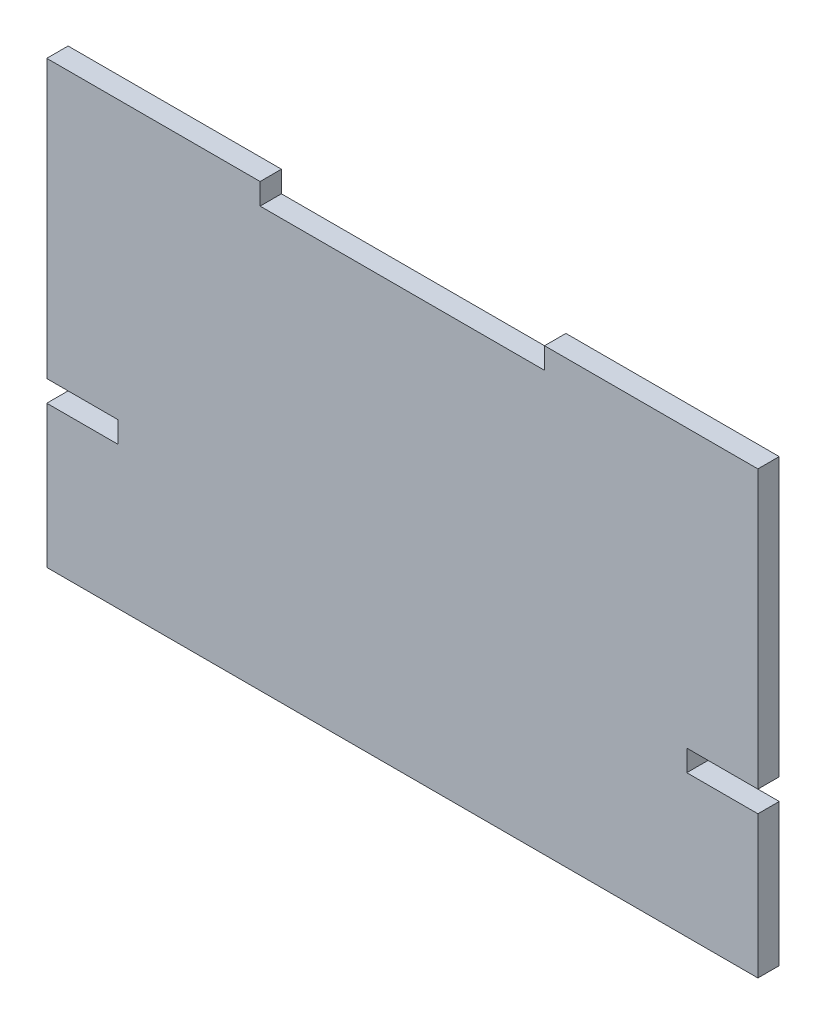
ISO-10303-21;
HEADER;
FILE_DESCRIPTION(('STEP AP214'),'2;1');
FILE_NAME('part.step','',(''),(''),'','','');
FILE_SCHEMA(('AUTOMOTIVE_DESIGN { 1 0 10303 214 1 1 1 1 }'));
ENDSEC;
DATA;
#1=APPLICATION_CONTEXT('core data for automotive mechanical design processes');
#2=APPLICATION_PROTOCOL_DEFINITION('international standard','automotive_design',2000,#1);
#3=PRODUCT_CONTEXT('',#1,'mechanical');
#4=PRODUCT('Part','Part','',(#3));
#5=PRODUCT_RELATED_PRODUCT_CATEGORY('part','',(#4));
#6=PRODUCT_DEFINITION_FORMATION('','',#4);
#7=PRODUCT_DEFINITION_CONTEXT('part definition',#1,'design');
#8=PRODUCT_DEFINITION('design','',#6,#7);
#9=PRODUCT_DEFINITION_SHAPE('','',#8);
#10=(LENGTH_UNIT() NAMED_UNIT(*) SI_UNIT(.MILLI.,.METRE.));
#11=(NAMED_UNIT(*) PLANE_ANGLE_UNIT() SI_UNIT($,.RADIAN.));
#12=(NAMED_UNIT(*) SI_UNIT($,.STERADIAN.) SOLID_ANGLE_UNIT());
#13=UNCERTAINTY_MEASURE_WITH_UNIT(LENGTH_MEASURE(1.E-05),#10,'distance_accuracy_value','');
#14=(GEOMETRIC_REPRESENTATION_CONTEXT(3) GLOBAL_UNCERTAINTY_ASSIGNED_CONTEXT((#13)) GLOBAL_UNIT_ASSIGNED_CONTEXT((#10,
#11,#12)) REPRESENTATION_CONTEXT('',''));
#15=CARTESIAN_POINT('',(0.,0.,0.));
#16=DIRECTION('',(0.,0.,1.));
#17=DIRECTION('',(1.,0.,0.));
#18=AXIS2_PLACEMENT_3D('',#15,#16,#17);
#19=CARTESIAN_POINT('',(-50.,-8.00000000000001,3.));
#20=DIRECTION('',(1.,0.,0.));
#21=DIRECTION('',(0.,0.,-1.));
#22=AXIS2_PLACEMENT_3D('',#19,#20,#21);
#23=PLANE('',#22);
#24=DIRECTION('',(0.,-1.,0.));
#25=VECTOR('',#24,1.);
#26=CARTESIAN_POINT('',(-50.,-8.00000000000001,0.));
#27=LINE('',#26,#25);
#28=CARTESIAN_POINT('',(-50.,31.,0.));
#29=VERTEX_POINT('',#28);
#30=CARTESIAN_POINT('',(-50.,-8.00000000000001,0.));
#31=VERTEX_POINT('',#30);
#32=EDGE_CURVE('E181',#29,#31,#27,.T.);
#33=ORIENTED_EDGE('',*,*,#32,.T.);
#34=DIRECTION('',(0.,0.,-1.));
#35=VECTOR('',#34,1.);
#36=CARTESIAN_POINT('',(-50.,-8.00000000000001,3.));
#37=LINE('',#36,#35);
#38=CARTESIAN_POINT('',(-50.,-8.00000000000001,3.));
#39=VERTEX_POINT('',#38);
#40=EDGE_CURVE('E11',#39,#31,#37,.T.);
#41=ORIENTED_EDGE('',*,*,#40,.F.);
#42=DIRECTION('',(0.,-1.,0.));
#43=VECTOR('',#42,1.);
#44=CARTESIAN_POINT('',(-50.,-8.00000000000001,3.));
#45=LINE('',#44,#43);
#46=CARTESIAN_POINT('',(-50.,31.,3.));
#47=VERTEX_POINT('',#46);
#48=EDGE_CURVE('E211',#47,#39,#45,.T.);
#49=ORIENTED_EDGE('',*,*,#48,.F.);
#50=DIRECTION('',(0.,0.,-1.));
#51=VECTOR('',#50,1.);
#52=CARTESIAN_POINT('',(-50.,31.,3.));
#53=LINE('',#52,#51);
#54=EDGE_CURVE('E177',#47,#29,#53,.T.);
#55=ORIENTED_EDGE('',*,*,#54,.T.);
#56=EDGE_LOOP('',(#33,#41,#49,#55));
#57=FACE_BOUND('',#56,.T.);
#58=ADVANCED_FACE('F37',(#57),#23,.F.);
#59=CARTESIAN_POINT('',(-40.,-8.00000000000001,3.));
#60=DIRECTION('',(0.,1.,0.));
#61=DIRECTION('',(0.,0.,1.));
#62=AXIS2_PLACEMENT_3D('',#59,#60,#61);
#63=PLANE('',#62);
#64=DIRECTION('',(1.,0.,0.));
#65=VECTOR('',#64,1.);
#66=CARTESIAN_POINT('',(-40.,-8.00000000000001,0.));
#67=LINE('',#66,#65);
#68=CARTESIAN_POINT('',(-40.,-8.00000000000001,0.));
#69=VERTEX_POINT('',#68);
#70=EDGE_CURVE('E184',#31,#69,#67,.T.);
#71=ORIENTED_EDGE('',*,*,#70,.T.);
#72=DIRECTION('',(0.,0.,-1.));
#73=VECTOR('',#72,1.);
#74=CARTESIAN_POINT('',(-40.,-8.00000000000001,3.));
#75=LINE('',#74,#73);
#76=CARTESIAN_POINT('',(-40.,-8.00000000000001,3.));
#77=VERTEX_POINT('',#76);
#78=EDGE_CURVE('E45',#77,#69,#75,.T.);
#79=ORIENTED_EDGE('',*,*,#78,.F.);
#80=DIRECTION('',(1.,0.,0.));
#81=VECTOR('',#80,1.);
#82=CARTESIAN_POINT('',(-40.,-8.00000000000001,3.));
#83=LINE('',#82,#81);
#84=EDGE_CURVE('E120',#39,#77,#83,.T.);
#85=ORIENTED_EDGE('',*,*,#84,.F.);
#86=ORIENTED_EDGE('',*,*,#40,.T.);
#87=EDGE_LOOP('',(#71,#79,#85,#86));
#88=FACE_BOUND('',#87,.T.);
#89=ADVANCED_FACE('F309',(#88),#63,.F.);
#90=CARTESIAN_POINT('',(-40.,-11.,3.));
#91=DIRECTION('',(1.,0.,0.));
#92=DIRECTION('',(0.,0.,-1.));
#93=AXIS2_PLACEMENT_3D('',#90,#91,#92);
#94=PLANE('',#93);
#95=DIRECTION('',(0.,-1.,0.));
#96=VECTOR('',#95,1.);
#97=CARTESIAN_POINT('',(-40.,-11.,0.));
#98=LINE('',#97,#96);
#99=CARTESIAN_POINT('',(-40.,-11.,0.));
#100=VERTEX_POINT('',#99);
#101=EDGE_CURVE('E186',#69,#100,#98,.T.);
#102=ORIENTED_EDGE('',*,*,#101,.T.);
#103=DIRECTION('',(0.,0.,-1.));
#104=VECTOR('',#103,1.);
#105=CARTESIAN_POINT('',(-40.,-11.,3.));
#106=LINE('',#105,#104);
#107=CARTESIAN_POINT('',(-40.,-11.,3.));
#108=VERTEX_POINT('',#107);
#109=EDGE_CURVE('E242',#108,#100,#106,.T.);
#110=ORIENTED_EDGE('',*,*,#109,.F.);
#111=DIRECTION('',(0.,-1.,0.));
#112=VECTOR('',#111,1.);
#113=CARTESIAN_POINT('',(-40.,-11.,3.));
#114=LINE('',#113,#112);
#115=EDGE_CURVE('E250',#77,#108,#114,.T.);
#116=ORIENTED_EDGE('',*,*,#115,.F.);
#117=ORIENTED_EDGE('',*,*,#78,.T.);
#118=EDGE_LOOP('',(#102,#110,#116,#117));
#119=FACE_BOUND('',#118,.T.);
#120=ADVANCED_FACE('F248',(#119),#94,.F.);
#121=CARTESIAN_POINT('',(-50.,-11.,3.));
#122=DIRECTION('',(0.,-1.,0.));
#123=DIRECTION('',(0.,0.,-1.));
#124=AXIS2_PLACEMENT_3D('',#121,#122,#123);
#125=PLANE('',#124);
#126=DIRECTION('',(-1.,0.,0.));
#127=VECTOR('',#126,1.);
#128=CARTESIAN_POINT('',(-50.,-11.,0.));
#129=LINE('',#128,#127);
#130=CARTESIAN_POINT('',(-50.,-11.,0.));
#131=VERTEX_POINT('',#130);
#132=EDGE_CURVE('E188',#100,#131,#129,.T.);
#133=ORIENTED_EDGE('',*,*,#132,.T.);
#134=DIRECTION('',(0.,0.,-1.));
#135=VECTOR('',#134,1.);
#136=CARTESIAN_POINT('',(-50.,-11.,3.));
#137=LINE('',#136,#135);
#138=CARTESIAN_POINT('',(-50.,-11.,3.));
#139=VERTEX_POINT('',#138);
#140=EDGE_CURVE('E239',#139,#131,#137,.T.);
#141=ORIENTED_EDGE('',*,*,#140,.F.);
#142=DIRECTION('',(-1.,0.,0.));
#143=VECTOR('',#142,1.);
#144=CARTESIAN_POINT('',(-50.,-11.,3.));
#145=LINE('',#144,#143);
#146=EDGE_CURVE('E268',#108,#139,#145,.T.);
#147=ORIENTED_EDGE('',*,*,#146,.F.);
#148=ORIENTED_EDGE('',*,*,#109,.T.);
#149=EDGE_LOOP('',(#133,#141,#147,#148));
#150=FACE_BOUND('',#149,.T.);
#151=ADVANCED_FACE('F259',(#150),#125,.F.);
#152=CARTESIAN_POINT('',(-50.,-31.,3.));
#153=DIRECTION('',(1.,0.,0.));
#154=DIRECTION('',(0.,0.,-1.));
#155=AXIS2_PLACEMENT_3D('',#152,#153,#154);
#156=PLANE('',#155);
#157=DIRECTION('',(0.,-1.,0.));
#158=VECTOR('',#157,1.);
#159=CARTESIAN_POINT('',(-50.,-31.,0.));
#160=LINE('',#159,#158);
#161=CARTESIAN_POINT('',(-50.,-31.,0.));
#162=VERTEX_POINT('',#161);
#163=EDGE_CURVE('E190',#131,#162,#160,.T.);
#164=ORIENTED_EDGE('',*,*,#163,.T.);
#165=DIRECTION('',(0.,0.,-1.));
#166=VECTOR('',#165,1.);
#167=CARTESIAN_POINT('',(-50.,-31.,3.));
#168=LINE('',#167,#166);
#169=CARTESIAN_POINT('',(-50.,-31.,3.));
#170=VERTEX_POINT('',#169);
#171=EDGE_CURVE('E236',#170,#162,#168,.T.);
#172=ORIENTED_EDGE('',*,*,#171,.F.);
#173=DIRECTION('',(0.,-1.,0.));
#174=VECTOR('',#173,1.);
#175=CARTESIAN_POINT('',(-50.,-31.,3.));
#176=LINE('',#175,#174);
#177=EDGE_CURVE('E265',#139,#170,#176,.T.);
#178=ORIENTED_EDGE('',*,*,#177,.F.);
#179=ORIENTED_EDGE('',*,*,#140,.T.);
#180=EDGE_LOOP('',(#164,#172,#178,#179));
#181=FACE_BOUND('',#180,.T.);
#182=ADVANCED_FACE('F263',(#181),#156,.F.);
#183=CARTESIAN_POINT('',(50.,-31.,3.));
#184=DIRECTION('',(0.,1.,0.));
#185=DIRECTION('',(-1.,0.,0.));
#186=AXIS2_PLACEMENT_3D('',#183,#184,#185);
#187=PLANE('',#186);
#188=DIRECTION('',(1.,0.,0.));
#189=VECTOR('',#188,1.);
#190=CARTESIAN_POINT('',(50.,-31.,0.));
#191=LINE('',#190,#189);
#192=CARTESIAN_POINT('',(50.,-31.,0.));
#193=VERTEX_POINT('',#192);
#194=EDGE_CURVE('E192',#162,#193,#191,.T.);
#195=ORIENTED_EDGE('',*,*,#194,.T.);
#196=DIRECTION('',(0.,0.,-1.));
#197=VECTOR('',#196,1.);
#198=CARTESIAN_POINT('',(50.,-31.,3.));
#199=LINE('',#198,#197);
#200=CARTESIAN_POINT('',(50.,-31.,3.));
#201=VERTEX_POINT('',#200);
#202=EDGE_CURVE('E233',#201,#193,#199,.T.);
#203=ORIENTED_EDGE('',*,*,#202,.F.);
#204=DIRECTION('',(1.,0.,0.));
#205=VECTOR('',#204,1.);
#206=CARTESIAN_POINT('',(50.,-31.,3.));
#207=LINE('',#206,#205);
#208=EDGE_CURVE('E267',#170,#201,#207,.T.);
#209=ORIENTED_EDGE('',*,*,#208,.F.);
#210=ORIENTED_EDGE('',*,*,#171,.T.);
#211=EDGE_LOOP('',(#195,#203,#209,#210));
#212=FACE_BOUND('',#211,.T.);
#213=ADVANCED_FACE('F322',(#212),#187,.F.);
#214=CARTESIAN_POINT('',(50.,-31.,3.));
#215=DIRECTION('',(-1.,0.,0.));
#216=DIRECTION('',(0.,0.,1.));
#217=AXIS2_PLACEMENT_3D('',#214,#215,#216);
#218=PLANE('',#217);
#219=DIRECTION('',(0.,1.,0.));
#220=VECTOR('',#219,1.);
#221=CARTESIAN_POINT('',(50.,-31.,0.));
#222=LINE('',#221,#220);
#223=CARTESIAN_POINT('',(50.,-11.,0.));
#224=VERTEX_POINT('',#223);
#225=EDGE_CURVE('E194',#193,#224,#222,.T.);
#226=ORIENTED_EDGE('',*,*,#225,.T.);
#227=DIRECTION('',(0.,0.,-1.));
#228=VECTOR('',#227,1.);
#229=CARTESIAN_POINT('',(50.,-11.,3.));
#230=LINE('',#229,#228);
#231=CARTESIAN_POINT('',(50.,-11.,3.));
#232=VERTEX_POINT('',#231);
#233=EDGE_CURVE('E230',#232,#224,#230,.T.);
#234=ORIENTED_EDGE('',*,*,#233,.F.);
#235=DIRECTION('',(0.,1.,0.));
#236=VECTOR('',#235,1.);
#237=CARTESIAN_POINT('',(50.,-31.,3.));
#238=LINE('',#237,#236);
#239=EDGE_CURVE('E270',#201,#232,#238,.T.);
#240=ORIENTED_EDGE('',*,*,#239,.F.);
#241=ORIENTED_EDGE('',*,*,#202,.T.);
#242=EDGE_LOOP('',(#226,#234,#240,#241));
#243=FACE_BOUND('',#242,.T.);
#244=ADVANCED_FACE('F325',(#243),#218,.F.);
#245=CARTESIAN_POINT('',(50.,-11.,3.));
#246=DIRECTION('',(0.,-1.,0.));
#247=DIRECTION('',(0.,0.,-1.));
#248=AXIS2_PLACEMENT_3D('',#245,#246,#247);
#249=PLANE('',#248);
#250=DIRECTION('',(-1.,0.,0.));
#251=VECTOR('',#250,1.);
#252=CARTESIAN_POINT('',(50.,-11.,0.));
#253=LINE('',#252,#251);
#254=CARTESIAN_POINT('',(40.,-11.,0.));
#255=VERTEX_POINT('',#254);
#256=EDGE_CURVE('E196',#224,#255,#253,.T.);
#257=ORIENTED_EDGE('',*,*,#256,.T.);
#258=DIRECTION('',(0.,0.,-1.));
#259=VECTOR('',#258,1.);
#260=CARTESIAN_POINT('',(40.,-11.,3.));
#261=LINE('',#260,#259);
#262=CARTESIAN_POINT('',(40.,-11.,3.));
#263=VERTEX_POINT('',#262);
#264=EDGE_CURVE('E227',#263,#255,#261,.T.);
#265=ORIENTED_EDGE('',*,*,#264,.F.);
#266=DIRECTION('',(-1.,0.,0.));
#267=VECTOR('',#266,1.);
#268=CARTESIAN_POINT('',(50.,-11.,3.));
#269=LINE('',#268,#267);
#270=EDGE_CURVE('E276',#232,#263,#269,.T.);
#271=ORIENTED_EDGE('',*,*,#270,.F.);
#272=ORIENTED_EDGE('',*,*,#233,.T.);
#273=EDGE_LOOP('',(#257,#265,#271,#272));
#274=FACE_BOUND('',#273,.T.);
#275=ADVANCED_FACE('F329',(#274),#249,.F.);
#276=CARTESIAN_POINT('',(40.,-11.,3.));
#277=DIRECTION('',(-1.,0.,0.));
#278=DIRECTION('',(0.,0.,1.));
#279=AXIS2_PLACEMENT_3D('',#276,#277,#278);
#280=PLANE('',#279);
#281=DIRECTION('',(0.,1.,0.));
#282=VECTOR('',#281,1.);
#283=CARTESIAN_POINT('',(40.,-11.,0.));
#284=LINE('',#283,#282);
#285=CARTESIAN_POINT('',(40.,-8.00000000000001,0.));
#286=VERTEX_POINT('',#285);
#287=EDGE_CURVE('E198',#255,#286,#284,.T.);
#288=ORIENTED_EDGE('',*,*,#287,.T.);
#289=DIRECTION('',(0.,0.,-1.));
#290=VECTOR('',#289,1.);
#291=CARTESIAN_POINT('',(40.,-8.00000000000001,3.));
#292=LINE('',#291,#290);
#293=CARTESIAN_POINT('',(40.,-8.00000000000001,3.));
#294=VERTEX_POINT('',#293);
#295=EDGE_CURVE('E224',#294,#286,#292,.T.);
#296=ORIENTED_EDGE('',*,*,#295,.F.);
#297=DIRECTION('',(0.,1.,0.));
#298=VECTOR('',#297,1.);
#299=CARTESIAN_POINT('',(40.,-11.,3.));
#300=LINE('',#299,#298);
#301=EDGE_CURVE('E278',#263,#294,#300,.T.);
#302=ORIENTED_EDGE('',*,*,#301,.F.);
#303=ORIENTED_EDGE('',*,*,#264,.T.);
#304=EDGE_LOOP('',(#288,#296,#302,#303));
#305=FACE_BOUND('',#304,.T.);
#306=ADVANCED_FACE('F333',(#305),#280,.F.);
#307=CARTESIAN_POINT('',(40.,-8.00000000000001,3.));
#308=DIRECTION('',(0.,1.,0.));
#309=DIRECTION('',(0.,0.,1.));
#310=AXIS2_PLACEMENT_3D('',#307,#308,#309);
#311=PLANE('',#310);
#312=DIRECTION('',(1.,0.,0.));
#313=VECTOR('',#312,1.);
#314=CARTESIAN_POINT('',(40.,-8.00000000000001,0.));
#315=LINE('',#314,#313);
#316=CARTESIAN_POINT('',(50.,-8.00000000000001,0.));
#317=VERTEX_POINT('',#316);
#318=EDGE_CURVE('E200',#286,#317,#315,.T.);
#319=ORIENTED_EDGE('',*,*,#318,.T.);
#320=DIRECTION('',(0.,0.,-1.));
#321=VECTOR('',#320,1.);
#322=CARTESIAN_POINT('',(50.,-8.00000000000001,3.));
#323=LINE('',#322,#321);
#324=CARTESIAN_POINT('',(50.,-8.00000000000001,3.));
#325=VERTEX_POINT('',#324);
#326=EDGE_CURVE('E221',#325,#317,#323,.T.);
#327=ORIENTED_EDGE('',*,*,#326,.F.);
#328=DIRECTION('',(1.,0.,0.));
#329=VECTOR('',#328,1.);
#330=CARTESIAN_POINT('',(40.,-8.00000000000001,3.));
#331=LINE('',#330,#329);
#332=EDGE_CURVE('E280',#294,#325,#331,.T.);
#333=ORIENTED_EDGE('',*,*,#332,.F.);
#334=ORIENTED_EDGE('',*,*,#295,.T.);
#335=EDGE_LOOP('',(#319,#327,#333,#334));
#336=FACE_BOUND('',#335,.T.);
#337=ADVANCED_FACE('F337',(#336),#311,.F.);
#338=CARTESIAN_POINT('',(50.,-8.00000000000001,3.));
#339=DIRECTION('',(-1.,0.,0.));
#340=DIRECTION('',(0.,0.,1.));
#341=AXIS2_PLACEMENT_3D('',#338,#339,#340);
#342=PLANE('',#341);
#343=DIRECTION('',(0.,1.,0.));
#344=VECTOR('',#343,1.);
#345=CARTESIAN_POINT('',(50.,-8.00000000000001,0.));
#346=LINE('',#345,#344);
#347=CARTESIAN_POINT('',(50.,31.,0.));
#348=VERTEX_POINT('',#347);
#349=EDGE_CURVE('E202',#317,#348,#346,.T.);
#350=ORIENTED_EDGE('',*,*,#349,.T.);
#351=DIRECTION('',(0.,0.,-1.));
#352=VECTOR('',#351,1.);
#353=CARTESIAN_POINT('',(50.,31.,3.));
#354=LINE('',#353,#352);
#355=CARTESIAN_POINT('',(50.,31.,3.));
#356=VERTEX_POINT('',#355);
#357=EDGE_CURVE('E218',#356,#348,#354,.T.);
#358=ORIENTED_EDGE('',*,*,#357,.F.);
#359=DIRECTION('',(0.,1.,0.));
#360=VECTOR('',#359,1.);
#361=CARTESIAN_POINT('',(50.,-8.00000000000001,3.));
#362=LINE('',#361,#360);
#363=EDGE_CURVE('E282',#325,#356,#362,.T.);
#364=ORIENTED_EDGE('',*,*,#363,.F.);
#365=ORIENTED_EDGE('',*,*,#326,.T.);
#366=EDGE_LOOP('',(#350,#358,#364,#365));
#367=FACE_BOUND('',#366,.T.);
#368=ADVANCED_FACE('F341',(#367),#342,.F.);
#369=CARTESIAN_POINT('',(50.,31.,3.));
#370=DIRECTION('',(0.,-1.,0.));
#371=DIRECTION('',(1.,0.,0.));
#372=AXIS2_PLACEMENT_3D('',#369,#370,#371);
#373=PLANE('',#372);
#374=DIRECTION('',(-1.,0.,0.));
#375=VECTOR('',#374,1.);
#376=CARTESIAN_POINT('',(50.,31.,0.));
#377=LINE('',#376,#375);
#378=CARTESIAN_POINT('',(20.,31.,0.));
#379=VERTEX_POINT('',#378);
#380=EDGE_CURVE('E204',#348,#379,#377,.T.);
#381=ORIENTED_EDGE('',*,*,#380,.T.);
#382=DIRECTION('',(0.,0.,-1.));
#383=VECTOR('',#382,1.);
#384=CARTESIAN_POINT('',(20.,31.,3.));
#385=LINE('',#384,#383);
#386=CARTESIAN_POINT('',(20.,31.,3.));
#387=VERTEX_POINT('',#386);
#388=EDGE_CURVE('E215',#387,#379,#385,.T.);
#389=ORIENTED_EDGE('',*,*,#388,.F.);
#390=DIRECTION('',(-1.,0.,0.));
#391=VECTOR('',#390,1.);
#392=CARTESIAN_POINT('',(50.,31.,3.));
#393=LINE('',#392,#391);
#394=EDGE_CURVE('E284',#356,#387,#393,.T.);
#395=ORIENTED_EDGE('',*,*,#394,.F.);
#396=ORIENTED_EDGE('',*,*,#357,.T.);
#397=EDGE_LOOP('',(#381,#389,#395,#396));
#398=FACE_BOUND('',#397,.T.);
#399=ADVANCED_FACE('F290',(#398),#373,.F.);
#400=CARTESIAN_POINT('',(20.,28.,3.));
#401=DIRECTION('',(1.,0.,0.));
#402=DIRECTION('',(0.,0.,-1.));
#403=AXIS2_PLACEMENT_3D('',#400,#401,#402);
#404=PLANE('',#403);
#405=DIRECTION('',(0.,-1.,0.));
#406=VECTOR('',#405,1.);
#407=CARTESIAN_POINT('',(20.,28.,0.));
#408=LINE('',#407,#406);
#409=CARTESIAN_POINT('',(20.,28.,0.));
#410=VERTEX_POINT('',#409);
#411=EDGE_CURVE('E206',#379,#410,#408,.T.);
#412=ORIENTED_EDGE('',*,*,#411,.T.);
#413=DIRECTION('',(0.,0.,-1.));
#414=VECTOR('',#413,1.);
#415=CARTESIAN_POINT('',(20.,28.,3.));
#416=LINE('',#415,#414);
#417=CARTESIAN_POINT('',(20.,28.,3.));
#418=VERTEX_POINT('',#417);
#419=EDGE_CURVE('E172',#418,#410,#416,.T.);
#420=ORIENTED_EDGE('',*,*,#419,.F.);
#421=DIRECTION('',(0.,-1.,0.));
#422=VECTOR('',#421,1.);
#423=CARTESIAN_POINT('',(20.,28.,3.));
#424=LINE('',#423,#422);
#425=EDGE_CURVE('E163',#387,#418,#424,.T.);
#426=ORIENTED_EDGE('',*,*,#425,.F.);
#427=ORIENTED_EDGE('',*,*,#388,.T.);
#428=EDGE_LOOP('',(#412,#420,#426,#427));
#429=FACE_BOUND('',#428,.T.);
#430=ADVANCED_FACE('F294',(#429),#404,.F.);
#431=CARTESIAN_POINT('',(-20.,28.,3.));
#432=DIRECTION('',(0.,-1.,0.));
#433=DIRECTION('',(0.,0.,-1.));
#434=AXIS2_PLACEMENT_3D('',#431,#432,#433);
#435=PLANE('',#434);
#436=DIRECTION('',(-1.,0.,0.));
#437=VECTOR('',#436,1.);
#438=CARTESIAN_POINT('',(-20.,28.,0.));
#439=LINE('',#438,#437);
#440=CARTESIAN_POINT('',(-20.,28.,0.));
#441=VERTEX_POINT('',#440);
#442=EDGE_CURVE('E171',#410,#441,#439,.T.);
#443=ORIENTED_EDGE('',*,*,#442,.T.);
#444=DIRECTION('',(0.,0.,-1.));
#445=VECTOR('',#444,1.);
#446=CARTESIAN_POINT('',(-20.,28.,3.));
#447=LINE('',#446,#445);
#448=CARTESIAN_POINT('',(-20.,28.,3.));
#449=VERTEX_POINT('',#448);
#450=EDGE_CURVE('E168',#449,#441,#447,.T.);
#451=ORIENTED_EDGE('',*,*,#450,.F.);
#452=DIRECTION('',(-1.,0.,0.));
#453=VECTOR('',#452,1.);
#454=CARTESIAN_POINT('',(-20.,28.,3.));
#455=LINE('',#454,#453);
#456=EDGE_CURVE('E157',#418,#449,#455,.T.);
#457=ORIENTED_EDGE('',*,*,#456,.F.);
#458=ORIENTED_EDGE('',*,*,#419,.T.);
#459=EDGE_LOOP('',(#443,#451,#457,#458));
#460=FACE_BOUND('',#459,.T.);
#461=ADVANCED_FACE('F169',(#460),#435,.F.);
#462=CARTESIAN_POINT('',(-20.,31.,3.));
#463=DIRECTION('',(-1.,0.,0.));
#464=DIRECTION('',(0.,0.,1.));
#465=AXIS2_PLACEMENT_3D('',#462,#463,#464);
#466=PLANE('',#465);
#467=DIRECTION('',(0.,1.,0.));
#468=VECTOR('',#467,1.);
#469=CARTESIAN_POINT('',(-20.,31.,0.));
#470=LINE('',#469,#468);
#471=CARTESIAN_POINT('',(-20.,31.,0.));
#472=VERTEX_POINT('',#471);
#473=EDGE_CURVE('E106',#441,#472,#470,.T.);
#474=ORIENTED_EDGE('',*,*,#473,.T.);
#475=DIRECTION('',(0.,0.,-1.));
#476=VECTOR('',#475,1.);
#477=CARTESIAN_POINT('',(-20.,31.,3.));
#478=LINE('',#477,#476);
#479=CARTESIAN_POINT('',(-20.,31.,3.));
#480=VERTEX_POINT('',#479);
#481=EDGE_CURVE('E173',#480,#472,#478,.T.);
#482=ORIENTED_EDGE('',*,*,#481,.F.);
#483=DIRECTION('',(0.,1.,0.));
#484=VECTOR('',#483,1.);
#485=CARTESIAN_POINT('',(-20.,31.,3.));
#486=LINE('',#485,#484);
#487=EDGE_CURVE('E161',#449,#480,#486,.T.);
#488=ORIENTED_EDGE('',*,*,#487,.F.);
#489=ORIENTED_EDGE('',*,*,#450,.T.);
#490=EDGE_LOOP('',(#474,#482,#488,#489));
#491=FACE_BOUND('',#490,.T.);
#492=ADVANCED_FACE('F175',(#491),#466,.F.);
#493=CARTESIAN_POINT('',(-20.,31.,3.));
#494=DIRECTION('',(0.,-1.,0.));
#495=DIRECTION('',(1.,0.,0.));
#496=AXIS2_PLACEMENT_3D('',#493,#494,#495);
#497=PLANE('',#496);
#498=DIRECTION('',(-1.,0.,0.));
#499=VECTOR('',#498,1.);
#500=CARTESIAN_POINT('',(-20.,31.,0.));
#501=LINE('',#500,#499);
#502=EDGE_CURVE('E112',#472,#29,#501,.T.);
#503=ORIENTED_EDGE('',*,*,#502,.T.);
#504=ORIENTED_EDGE('',*,*,#54,.F.);
#505=DIRECTION('',(-1.,0.,0.));
#506=VECTOR('',#505,1.);
#507=CARTESIAN_POINT('',(-20.,31.,3.));
#508=LINE('',#507,#506);
#509=EDGE_CURVE('E53',#480,#47,#508,.T.);
#510=ORIENTED_EDGE('',*,*,#509,.F.);
#511=ORIENTED_EDGE('',*,*,#481,.T.);
#512=EDGE_LOOP('',(#503,#504,#510,#511));
#513=FACE_BOUND('',#512,.T.);
#514=ADVANCED_FACE('F298',(#513),#497,.F.);
#515=CARTESIAN_POINT('',(0.,0.,3.));
#516=DIRECTION('',(0.,0.,1.));
#517=DIRECTION('',(1.,0.,0.));
#518=AXIS2_PLACEMENT_3D('',#515,#516,#517);
#519=PLANE('',#518);
#520=ORIENTED_EDGE('',*,*,#48,.T.);
#521=ORIENTED_EDGE('',*,*,#84,.T.);
#522=ORIENTED_EDGE('',*,*,#115,.T.);
#523=ORIENTED_EDGE('',*,*,#146,.T.);
#524=ORIENTED_EDGE('',*,*,#177,.T.);
#525=ORIENTED_EDGE('',*,*,#208,.T.);
#526=ORIENTED_EDGE('',*,*,#239,.T.);
#527=ORIENTED_EDGE('',*,*,#270,.T.);
#528=ORIENTED_EDGE('',*,*,#301,.T.);
#529=ORIENTED_EDGE('',*,*,#332,.T.);
#530=ORIENTED_EDGE('',*,*,#363,.T.);
#531=ORIENTED_EDGE('',*,*,#394,.T.);
#532=ORIENTED_EDGE('',*,*,#425,.T.);
#533=ORIENTED_EDGE('',*,*,#456,.T.);
#534=ORIENTED_EDGE('',*,*,#487,.T.);
#535=ORIENTED_EDGE('',*,*,#509,.T.);
#536=EDGE_LOOP('',(#520,#521,#522,#523,#524,#525,#526,#527,#528,#529,#530,#531,#532,#533,#534,#535));
#537=FACE_BOUND('',#536,.T.);
#538=ADVANCED_FACE('F159',(#537),#519,.T.);
#539=CARTESIAN_POINT('',(0.,0.,0.));
#540=DIRECTION('',(0.,0.,1.));
#541=DIRECTION('',(1.,0.,0.));
#542=AXIS2_PLACEMENT_3D('',#539,#540,#541);
#543=PLANE('',#542);
#544=ORIENTED_EDGE('',*,*,#32,.F.);
#545=ORIENTED_EDGE('',*,*,#502,.F.);
#546=ORIENTED_EDGE('',*,*,#473,.F.);
#547=ORIENTED_EDGE('',*,*,#442,.F.);
#548=ORIENTED_EDGE('',*,*,#411,.F.);
#549=ORIENTED_EDGE('',*,*,#380,.F.);
#550=ORIENTED_EDGE('',*,*,#349,.F.);
#551=ORIENTED_EDGE('',*,*,#318,.F.);
#552=ORIENTED_EDGE('',*,*,#287,.F.);
#553=ORIENTED_EDGE('',*,*,#256,.F.);
#554=ORIENTED_EDGE('',*,*,#225,.F.);
#555=ORIENTED_EDGE('',*,*,#194,.F.);
#556=ORIENTED_EDGE('',*,*,#163,.F.);
#557=ORIENTED_EDGE('',*,*,#132,.F.);
#558=ORIENTED_EDGE('',*,*,#101,.F.);
#559=ORIENTED_EDGE('',*,*,#70,.F.);
#560=EDGE_LOOP('',(#544,#545,#546,#547,#548,#549,#550,#551,#552,#553,#554,#555,#556,#557,#558,#559));
#561=FACE_BOUND('',#560,.T.);
#562=ADVANCED_FACE('F254',(#561),#543,.F.);
#563=CLOSED_SHELL('',(#58,#89,#120,#151,#182,#213,#244,#275,#306,#337,#368,#399,#430,#461,#492,
#514,#538,#562));
#564=MANIFOLD_SOLID_BREP('B2',#563);
#565=ADVANCED_BREP_SHAPE_REPRESENTATION('',(#18,#564),#14);
#566=SHAPE_DEFINITION_REPRESENTATION(#9,#565);
ENDSEC;
END-ISO-10303-21;
